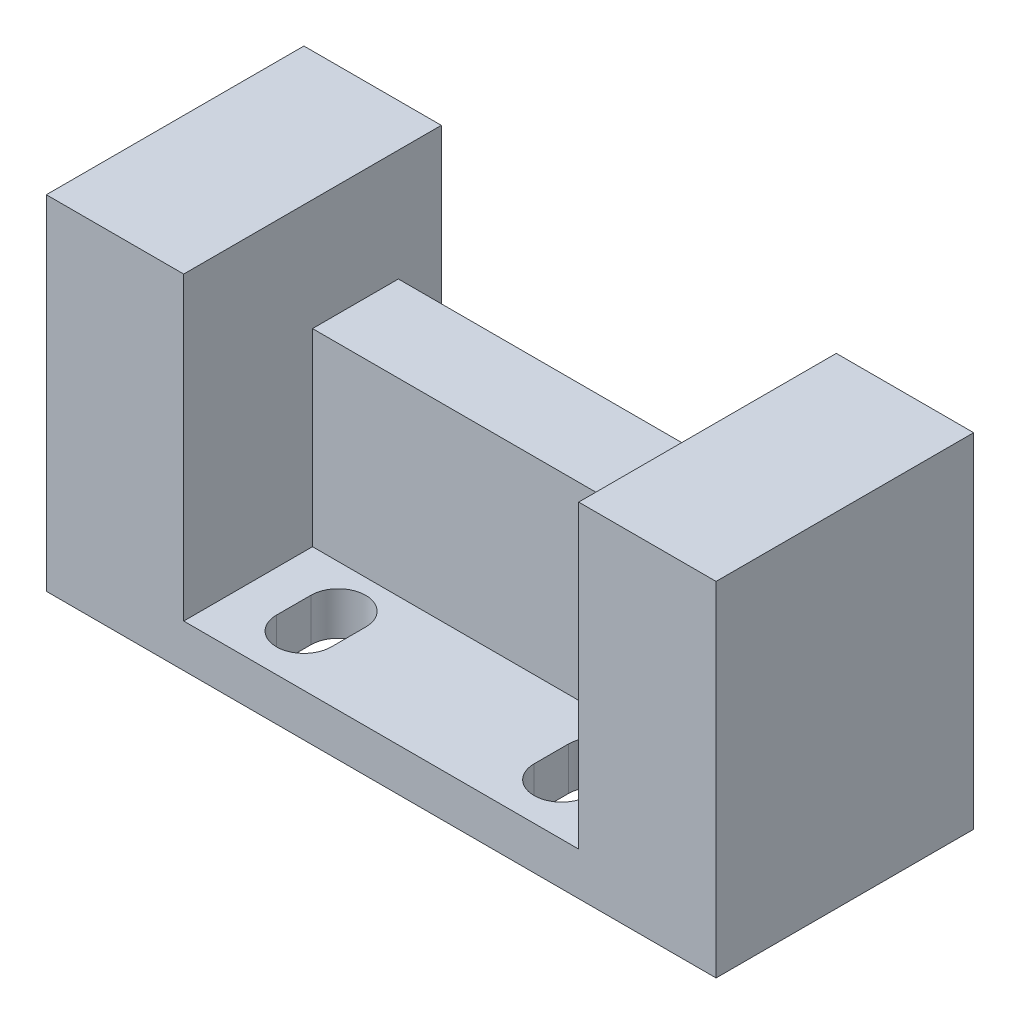
ISO-10303-21;
HEADER;
FILE_DESCRIPTION(('STEP AP214'),'2;1');
FILE_NAME('part.step','',(''),(''),'','','');
FILE_SCHEMA(('AUTOMOTIVE_DESIGN { 1 0 10303 214 1 1 1 1 }'));
ENDSEC;
DATA;
#1=APPLICATION_CONTEXT('core data for automotive mechanical design processes');
#2=APPLICATION_PROTOCOL_DEFINITION('international standard','automotive_design',2000,#1);
#3=PRODUCT_CONTEXT('',#1,'mechanical');
#4=PRODUCT('Part','Part','',(#3));
#5=PRODUCT_RELATED_PRODUCT_CATEGORY('part','',(#4));
#6=PRODUCT_DEFINITION_FORMATION('','',#4);
#7=PRODUCT_DEFINITION_CONTEXT('part definition',#1,'design');
#8=PRODUCT_DEFINITION('design','',#6,#7);
#9=PRODUCT_DEFINITION_SHAPE('','',#8);
#10=(LENGTH_UNIT() NAMED_UNIT(*) SI_UNIT(.MILLI.,.METRE.));
#11=(NAMED_UNIT(*) PLANE_ANGLE_UNIT() SI_UNIT($,.RADIAN.));
#12=(NAMED_UNIT(*) SI_UNIT($,.STERADIAN.) SOLID_ANGLE_UNIT());
#13=UNCERTAINTY_MEASURE_WITH_UNIT(LENGTH_MEASURE(1.E-05),#10,'distance_accuracy_value','');
#14=(GEOMETRIC_REPRESENTATION_CONTEXT(3) GLOBAL_UNCERTAINTY_ASSIGNED_CONTEXT((#13)) GLOBAL_UNIT_ASSIGNED_CONTEXT((#10,
#11,#12)) REPRESENTATION_CONTEXT('',''));
#15=CARTESIAN_POINT('',(0.,0.,0.));
#16=DIRECTION('',(0.,0.,1.));
#17=DIRECTION('',(1.,0.,0.));
#18=AXIS2_PLACEMENT_3D('',#15,#16,#17);
#19=CARTESIAN_POINT('',(0.,2.5,0.));
#20=DIRECTION('',(0.,1.,0.));
#21=DIRECTION('',(0.,0.,1.));
#22=AXIS2_PLACEMENT_3D('',#19,#20,#21);
#23=PLANE('',#22);
#24=DIRECTION('',(0.,0.,-1.));
#25=VECTOR('',#24,1.);
#26=CARTESIAN_POINT('',(8.,2.5,10.));
#27=LINE('',#26,#25);
#28=CARTESIAN_POINT('',(8.,2.5,2.5));
#29=VERTEX_POINT('',#28);
#30=CARTESIAN_POINT('',(8.,2.5,1.00000000000001));
#31=VERTEX_POINT('',#30);
#32=EDGE_CURVE('E318',#29,#31,#27,.T.);
#33=ORIENTED_EDGE('',*,*,#32,.F.);
#34=DIRECTION('',(1.,0.,0.));
#35=VECTOR('',#34,1.);
#36=CARTESIAN_POINT('',(-0.00199999999999853,2.5,2.5));
#37=LINE('',#36,#35);
#38=CARTESIAN_POINT('',(31.,2.5,2.5));
#39=VERTEX_POINT('',#38);
#40=EDGE_CURVE('E216',#29,#39,#37,.T.);
#41=ORIENTED_EDGE('',*,*,#40,.T.);
#42=DIRECTION('',(0.,0.,-1.));
#43=VECTOR('',#42,1.);
#44=CARTESIAN_POINT('',(31.,2.5,0.));
#45=LINE('',#44,#43);
#46=CARTESIAN_POINT('',(31.,2.5,1.00000000000001));
#47=VERTEX_POINT('',#46);
#48=EDGE_CURVE('E195',#39,#47,#45,.T.);
#49=ORIENTED_EDGE('',*,*,#48,.T.);
#50=DIRECTION('',(-1.,0.,0.));
#51=VECTOR('',#50,1.);
#52=CARTESIAN_POINT('',(0.,2.5,1.00000000000001));
#53=LINE('',#52,#51);
#54=EDGE_CURVE('E352',#47,#31,#53,.T.);
#55=ORIENTED_EDGE('',*,*,#54,.T.);
#56=EDGE_LOOP('',(#33,#41,#49,#55));
#57=FACE_BOUND('',#56,.T.);
#58=ADVANCED_FACE('F43',(#57),#23,.T.);
#59=CARTESIAN_POINT('',(31.,0.,10.));
#60=DIRECTION('',(1.,0.,0.));
#61=DIRECTION('',(0.,0.,-1.));
#62=AXIS2_PLACEMENT_3D('',#59,#60,#61);
#63=PLANE('',#62);
#64=DIRECTION('',(0.,-1.,0.));
#65=VECTOR('',#64,1.);
#66=CARTESIAN_POINT('',(31.,2.5,2.5));
#67=LINE('',#66,#65);
#68=CARTESIAN_POINT('',(31.,13.5,2.49999999999999));
#69=VERTEX_POINT('',#68);
#70=EDGE_CURVE('E187',#69,#39,#67,.T.);
#71=ORIENTED_EDGE('',*,*,#70,.F.);
#72=DIRECTION('',(0.,0.,-1.));
#73=VECTOR('',#72,1.);
#74=CARTESIAN_POINT('',(31.,13.5,2.49999999999999));
#75=LINE('',#74,#73);
#76=CARTESIAN_POINT('',(31.,13.5,7.49999999999999));
#77=VERTEX_POINT('',#76);
#78=EDGE_CURVE('E188',#77,#69,#75,.T.);
#79=ORIENTED_EDGE('',*,*,#78,.F.);
#80=DIRECTION('',(0.,1.,0.));
#81=VECTOR('',#80,1.);
#82=CARTESIAN_POINT('',(31.,2.5,7.5));
#83=LINE('',#82,#81);
#84=CARTESIAN_POINT('',(31.,2.5,7.5));
#85=VERTEX_POINT('',#84);
#86=EDGE_CURVE('E205',#85,#77,#83,.T.);
#87=ORIENTED_EDGE('',*,*,#86,.F.);
#88=CARTESIAN_POINT('',(31.,2.5,15.));
#89=VERTEX_POINT('',#88);
#90=EDGE_CURVE('E342',#89,#85,#45,.T.);
#91=ORIENTED_EDGE('',*,*,#90,.F.);
#92=DIRECTION('',(0.,1.,0.));
#93=VECTOR('',#92,1.);
#94=CARTESIAN_POINT('',(31.,2.5,15.));
#95=LINE('',#94,#93);
#96=CARTESIAN_POINT('',(31.,20.,15.));
#97=VERTEX_POINT('',#96);
#98=EDGE_CURVE('E230',#89,#97,#95,.T.);
#99=ORIENTED_EDGE('',*,*,#98,.T.);
#100=DIRECTION('',(0.,0.,-1.));
#101=VECTOR('',#100,1.);
#102=CARTESIAN_POINT('',(31.,20.,10.));
#103=LINE('',#102,#101);
#104=CARTESIAN_POINT('',(31.,20.,0.));
#105=VERTEX_POINT('',#104);
#106=EDGE_CURVE('E301',#97,#105,#103,.T.);
#107=ORIENTED_EDGE('',*,*,#106,.T.);
#108=DIRECTION('',(0.,-1.,0.));
#109=VECTOR('',#108,1.);
#110=CARTESIAN_POINT('',(31.,0.,0.));
#111=LINE('',#110,#109);
#112=CARTESIAN_POINT('',(31.,1.49999999999999,0.));
#113=VERTEX_POINT('',#112);
#114=EDGE_CURVE('E306',#105,#113,#111,.T.);
#115=ORIENTED_EDGE('',*,*,#114,.T.);
#116=DIRECTION('',(0.,-0.707106781186545,-0.70710678118655));
#117=VECTOR('',#116,1.);
#118=CARTESIAN_POINT('',(31.,5.75,4.25000000000004));
#119=LINE('',#118,#117);
#120=EDGE_CURVE('E351',#113,#47,#119,.F.);
#121=ORIENTED_EDGE('',*,*,#120,.T.);
#122=ORIENTED_EDGE('',*,*,#48,.F.);
#123=EDGE_LOOP('',(#71,#79,#87,#91,#99,#107,#115,#121,#122));
#124=FACE_BOUND('',#123,.T.);
#125=ADVANCED_FACE('F189',(#124),#63,.F.);
#126=DIRECTION('',(1.,0.,0.));
#127=VECTOR('',#126,1.);
#128=CARTESIAN_POINT('',(-0.00199999999999853,2.5,7.5));
#129=LINE('',#128,#127);
#130=CARTESIAN_POINT('',(8.,2.5,7.5));
#131=VERTEX_POINT('',#130);
#132=EDGE_CURVE('E215',#131,#85,#129,.T.);
#133=ORIENTED_EDGE('',*,*,#132,.F.);
#134=CARTESIAN_POINT('',(8.,2.5,15.));
#135=VERTEX_POINT('',#134);
#136=EDGE_CURVE('E326',#135,#131,#27,.T.);
#137=ORIENTED_EDGE('',*,*,#136,.F.);
#138=DIRECTION('',(-1.,0.,0.));
#139=VECTOR('',#138,1.);
#140=CARTESIAN_POINT('',(0.,2.5,15.));
#141=LINE('',#140,#139);
#142=EDGE_CURVE('E307',#89,#135,#141,.T.);
#143=ORIENTED_EDGE('',*,*,#142,.F.);
#144=ORIENTED_EDGE('',*,*,#90,.T.);
#145=EDGE_LOOP('',(#133,#137,#143,#144));
#146=FACE_BOUND('',#145,.T.);
#147=CARTESIAN_POINT('',(12.,2.5,12.));
#148=DIRECTION('',(0.,1.,0.));
#149=DIRECTION('',(0.,0.,1.));
#150=AXIS2_PLACEMENT_3D('',#147,#148,#149);
#151=CIRCLE('',#150,1.6);
#152=CARTESIAN_POINT('',(10.4,2.5,12.));
#153=VERTEX_POINT('',#152);
#154=CARTESIAN_POINT('',(13.6,2.5,12.));
#155=VERTEX_POINT('',#154);
#156=EDGE_CURVE('E231',#153,#155,#151,.T.);
#157=ORIENTED_EDGE('',*,*,#156,.F.);
#158=DIRECTION('',(0.,0.,1.));
#159=VECTOR('',#158,1.);
#160=CARTESIAN_POINT('',(10.4,2.5,12.));
#161=LINE('',#160,#159);
#162=CARTESIAN_POINT('',(10.4,2.5,10.));
#163=VERTEX_POINT('',#162);
#164=EDGE_CURVE('E245',#163,#153,#161,.T.);
#165=ORIENTED_EDGE('',*,*,#164,.F.);
#166=CARTESIAN_POINT('',(12.,2.5,10.));
#167=DIRECTION('',(0.,1.,0.));
#168=DIRECTION('',(0.,0.,1.));
#169=AXIS2_PLACEMENT_3D('',#166,#167,#168);
#170=CIRCLE('',#169,1.6);
#171=CARTESIAN_POINT('',(13.6,2.5,10.));
#172=VERTEX_POINT('',#171);
#173=EDGE_CURVE('E237',#172,#163,#170,.T.);
#174=ORIENTED_EDGE('',*,*,#173,.F.);
#175=DIRECTION('',(0.,0.,-1.));
#176=VECTOR('',#175,1.);
#177=CARTESIAN_POINT('',(13.6,2.5,12.));
#178=LINE('',#177,#176);
#179=EDGE_CURVE('E232',#155,#172,#178,.T.);
#180=ORIENTED_EDGE('',*,*,#179,.F.);
#181=EDGE_LOOP('',(#157,#165,#174,#180));
#182=FACE_BOUND('',#181,.T.);
#183=CARTESIAN_POINT('',(27.,2.5,12.));
#184=DIRECTION('',(0.,1.,0.));
#185=DIRECTION('',(0.,0.,1.));
#186=AXIS2_PLACEMENT_3D('',#183,#184,#185);
#187=CIRCLE('',#186,1.6);
#188=CARTESIAN_POINT('',(25.4,2.5,12.));
#189=VERTEX_POINT('',#188);
#190=CARTESIAN_POINT('',(28.6,2.5,12.));
#191=VERTEX_POINT('',#190);
#192=EDGE_CURVE('E236',#189,#191,#187,.T.);
#193=ORIENTED_EDGE('',*,*,#192,.F.);
#194=DIRECTION('',(0.,0.,1.));
#195=VECTOR('',#194,1.);
#196=CARTESIAN_POINT('',(25.4,2.5,12.));
#197=LINE('',#196,#195);
#198=CARTESIAN_POINT('',(25.4,2.5,10.));
#199=VERTEX_POINT('',#198);
#200=EDGE_CURVE('E260',#199,#189,#197,.T.);
#201=ORIENTED_EDGE('',*,*,#200,.F.);
#202=CARTESIAN_POINT('',(27.,2.5,10.));
#203=DIRECTION('',(0.,1.,0.));
#204=DIRECTION('',(0.,0.,1.));
#205=AXIS2_PLACEMENT_3D('',#202,#203,#204);
#206=CIRCLE('',#205,1.6);
#207=CARTESIAN_POINT('',(28.6,2.5,10.));
#208=VERTEX_POINT('',#207);
#209=EDGE_CURVE('E267',#208,#199,#206,.T.);
#210=ORIENTED_EDGE('',*,*,#209,.F.);
#211=DIRECTION('',(0.,0.,-1.));
#212=VECTOR('',#211,1.);
#213=CARTESIAN_POINT('',(28.6,2.5,12.));
#214=LINE('',#213,#212);
#215=EDGE_CURVE('E266',#191,#208,#214,.T.);
#216=ORIENTED_EDGE('',*,*,#215,.F.);
#217=EDGE_LOOP('',(#193,#201,#210,#216));
#218=FACE_BOUND('',#217,.T.);
#219=ADVANCED_FACE('F387',(#146,#182,#218),#23,.T.);
#220=CARTESIAN_POINT('',(0.,0.,10.));
#221=DIRECTION('',(1.,0.,0.));
#222=DIRECTION('',(0.,1.,0.));
#223=AXIS2_PLACEMENT_3D('',#220,#221,#222);
#224=PLANE('',#223);
#225=DIRECTION('',(0.,0.,-1.));
#226=VECTOR('',#225,1.);
#227=CARTESIAN_POINT('',(0.,0.,10.));
#228=LINE('',#227,#226);
#229=CARTESIAN_POINT('',(0.,0.,15.));
#230=VERTEX_POINT('',#229);
#231=CARTESIAN_POINT('',(0.,0.,0.));
#232=VERTEX_POINT('',#231);
#233=EDGE_CURVE('E341',#230,#232,#228,.T.);
#234=ORIENTED_EDGE('',*,*,#233,.F.);
#235=DIRECTION('',(0.,-1.,0.));
#236=VECTOR('',#235,1.);
#237=CARTESIAN_POINT('',(0.,2.5,15.));
#238=LINE('',#237,#236);
#239=CARTESIAN_POINT('',(0.,20.,15.));
#240=VERTEX_POINT('',#239);
#241=EDGE_CURVE('E320',#240,#230,#238,.T.);
#242=ORIENTED_EDGE('',*,*,#241,.F.);
#243=DIRECTION('',(0.,0.,-1.));
#244=VECTOR('',#243,1.);
#245=CARTESIAN_POINT('',(0.,20.,10.));
#246=LINE('',#245,#244);
#247=CARTESIAN_POINT('',(0.,20.,0.));
#248=VERTEX_POINT('',#247);
#249=EDGE_CURVE('E337',#240,#248,#246,.T.);
#250=ORIENTED_EDGE('',*,*,#249,.T.);
#251=DIRECTION('',(0.,-1.,0.));
#252=VECTOR('',#251,1.);
#253=CARTESIAN_POINT('',(0.,0.,0.));
#254=LINE('',#253,#252);
#255=EDGE_CURVE('E329',#248,#232,#254,.T.);
#256=ORIENTED_EDGE('',*,*,#255,.T.);
#257=EDGE_LOOP('',(#234,#242,#250,#256));
#258=FACE_BOUND('',#257,.T.);
#259=ADVANCED_FACE('F422',(#258),#224,.F.);
#260=CARTESIAN_POINT('',(0.,0.,10.));
#261=DIRECTION('',(0.,1.,0.));
#262=DIRECTION('',(0.,0.,1.));
#263=AXIS2_PLACEMENT_3D('',#260,#261,#262);
#264=PLANE('',#263);
#265=DIRECTION('',(0.,0.,1.));
#266=VECTOR('',#265,1.);
#267=CARTESIAN_POINT('',(10.4,0.,10.));
#268=LINE('',#267,#266);
#269=CARTESIAN_POINT('',(10.4,0.,10.));
#270=VERTEX_POINT('',#269);
#271=CARTESIAN_POINT('',(10.4,0.,12.));
#272=VERTEX_POINT('',#271);
#273=EDGE_CURVE('E55',#270,#272,#268,.T.);
#274=ORIENTED_EDGE('',*,*,#273,.T.);
#275=CARTESIAN_POINT('',(12.,0.,12.));
#276=DIRECTION('',(0.,1.,0.));
#277=DIRECTION('',(0.,0.,1.));
#278=AXIS2_PLACEMENT_3D('',#275,#276,#277);
#279=CIRCLE('',#278,1.6);
#280=CARTESIAN_POINT('',(13.6,0.,12.));
#281=VERTEX_POINT('',#280);
#282=EDGE_CURVE('E11',#272,#281,#279,.T.);
#283=ORIENTED_EDGE('',*,*,#282,.T.);
#284=DIRECTION('',(0.,0.,-1.));
#285=VECTOR('',#284,1.);
#286=CARTESIAN_POINT('',(13.6,0.,10.));
#287=LINE('',#286,#285);
#288=CARTESIAN_POINT('',(13.6,0.,10.));
#289=VERTEX_POINT('',#288);
#290=EDGE_CURVE('E367',#281,#289,#287,.T.);
#291=ORIENTED_EDGE('',*,*,#290,.T.);
#292=CARTESIAN_POINT('',(12.,0.,10.));
#293=DIRECTION('',(0.,1.,0.));
#294=DIRECTION('',(0.,0.,1.));
#295=AXIS2_PLACEMENT_3D('',#292,#293,#294);
#296=CIRCLE('',#295,1.6);
#297=EDGE_CURVE('E375',#289,#270,#296,.T.);
#298=ORIENTED_EDGE('',*,*,#297,.T.);
#299=EDGE_LOOP('',(#274,#283,#291,#298));
#300=FACE_BOUND('',#299,.T.);
#301=DIRECTION('',(0.,0.,1.));
#302=VECTOR('',#301,1.);
#303=CARTESIAN_POINT('',(25.4,0.,10.));
#304=LINE('',#303,#302);
#305=CARTESIAN_POINT('',(25.4,0.,10.));
#306=VERTEX_POINT('',#305);
#307=CARTESIAN_POINT('',(25.4,0.,12.));
#308=VERTEX_POINT('',#307);
#309=EDGE_CURVE('E361',#306,#308,#304,.T.);
#310=ORIENTED_EDGE('',*,*,#309,.T.);
#311=CARTESIAN_POINT('',(27.,0.,12.));
#312=DIRECTION('',(0.,1.,0.));
#313=DIRECTION('',(0.,0.,1.));
#314=AXIS2_PLACEMENT_3D('',#311,#312,#313);
#315=CIRCLE('',#314,1.6);
#316=CARTESIAN_POINT('',(28.6,0.,12.));
#317=VERTEX_POINT('',#316);
#318=EDGE_CURVE('E366',#308,#317,#315,.T.);
#319=ORIENTED_EDGE('',*,*,#318,.T.);
#320=DIRECTION('',(0.,0.,-1.));
#321=VECTOR('',#320,1.);
#322=CARTESIAN_POINT('',(28.6,0.,9.99999999999995));
#323=LINE('',#322,#321);
#324=CARTESIAN_POINT('',(28.6,0.,10.));
#325=VERTEX_POINT('',#324);
#326=EDGE_CURVE('E293',#317,#325,#323,.T.);
#327=ORIENTED_EDGE('',*,*,#326,.T.);
#328=CARTESIAN_POINT('',(27.,0.,10.));
#329=DIRECTION('',(0.,1.,0.));
#330=DIRECTION('',(0.,0.,1.));
#331=AXIS2_PLACEMENT_3D('',#328,#329,#330);
#332=CIRCLE('',#331,1.6);
#333=EDGE_CURVE('E359',#325,#306,#332,.T.);
#334=ORIENTED_EDGE('',*,*,#333,.T.);
#335=EDGE_LOOP('',(#310,#319,#327,#334));
#336=FACE_BOUND('',#335,.T.);
#337=DIRECTION('',(0.,0.,1.));
#338=VECTOR('',#337,1.);
#339=CARTESIAN_POINT('',(39.,0.,0.));
#340=LINE('',#339,#338);
#341=CARTESIAN_POINT('',(39.,0.,0.));
#342=VERTEX_POINT('',#341);
#343=CARTESIAN_POINT('',(39.,0.,15.));
#344=VERTEX_POINT('',#343);
#345=EDGE_CURVE('E308',#342,#344,#340,.T.);
#346=ORIENTED_EDGE('',*,*,#345,.T.);
#347=DIRECTION('',(-1.,0.,0.));
#348=VECTOR('',#347,1.);
#349=CARTESIAN_POINT('',(0.,0.,15.));
#350=LINE('',#349,#348);
#351=EDGE_CURVE('E312',#344,#230,#350,.T.);
#352=ORIENTED_EDGE('',*,*,#351,.T.);
#353=ORIENTED_EDGE('',*,*,#233,.T.);
#354=DIRECTION('',(1.,0.,0.));
#355=VECTOR('',#354,1.);
#356=CARTESIAN_POINT('',(0.,0.,0.));
#357=LINE('',#356,#355);
#358=EDGE_CURVE('E330',#232,#342,#357,.T.);
#359=ORIENTED_EDGE('',*,*,#358,.T.);
#360=EDGE_LOOP('',(#346,#352,#353,#359));
#361=FACE_BOUND('',#360,.T.);
#362=ADVANCED_FACE('F376',(#300,#336,#361),#264,.F.);
#363=CARTESIAN_POINT('',(8.,0.,10.));
#364=DIRECTION('',(-1.,0.,0.));
#365=DIRECTION('',(0.,-1.,0.));
#366=AXIS2_PLACEMENT_3D('',#363,#364,#365);
#367=PLANE('',#366);
#368=DIRECTION('',(0.,0.,-1.));
#369=VECTOR('',#368,1.);
#370=CARTESIAN_POINT('',(8.,13.5,2.49999999999999));
#371=LINE('',#370,#369);
#372=CARTESIAN_POINT('',(8.,13.5,7.49999999999999));
#373=VERTEX_POINT('',#372);
#374=CARTESIAN_POINT('',(8.,13.5,2.49999999999999));
#375=VERTEX_POINT('',#374);
#376=EDGE_CURVE('E65',#373,#375,#371,.T.);
#377=ORIENTED_EDGE('',*,*,#376,.T.);
#378=DIRECTION('',(0.,-1.,0.));
#379=VECTOR('',#378,1.);
#380=CARTESIAN_POINT('',(8.,2.5,2.5));
#381=LINE('',#380,#379);
#382=EDGE_CURVE('E202',#375,#29,#381,.T.);
#383=ORIENTED_EDGE('',*,*,#382,.T.);
#384=ORIENTED_EDGE('',*,*,#32,.T.);
#385=DIRECTION('',(0.,0.707106781186545,0.70710678118655));
#386=VECTOR('',#385,1.);
#387=CARTESIAN_POINT('',(8.,5.75,4.25000000000004));
#388=LINE('',#387,#386);
#389=CARTESIAN_POINT('',(8.,1.49999999999999,0.));
#390=VERTEX_POINT('',#389);
#391=EDGE_CURVE('E292',#31,#390,#388,.F.);
#392=ORIENTED_EDGE('',*,*,#391,.T.);
#393=DIRECTION('',(0.,1.,0.));
#394=VECTOR('',#393,1.);
#395=CARTESIAN_POINT('',(8.,0.,0.));
#396=LINE('',#395,#394);
#397=CARTESIAN_POINT('',(8.,20.,0.));
#398=VERTEX_POINT('',#397);
#399=EDGE_CURVE('E334',#390,#398,#396,.T.);
#400=ORIENTED_EDGE('',*,*,#399,.T.);
#401=DIRECTION('',(0.,0.,-1.));
#402=VECTOR('',#401,1.);
#403=CARTESIAN_POINT('',(8.,20.,10.));
#404=LINE('',#403,#402);
#405=CARTESIAN_POINT('',(8.,20.,15.));
#406=VERTEX_POINT('',#405);
#407=EDGE_CURVE('E339',#406,#398,#404,.T.);
#408=ORIENTED_EDGE('',*,*,#407,.F.);
#409=DIRECTION('',(0.,-1.,0.));
#410=VECTOR('',#409,1.);
#411=CARTESIAN_POINT('',(8.,2.5,15.));
#412=LINE('',#411,#410);
#413=EDGE_CURVE('E222',#406,#135,#412,.T.);
#414=ORIENTED_EDGE('',*,*,#413,.T.);
#415=ORIENTED_EDGE('',*,*,#136,.T.);
#416=DIRECTION('',(0.,1.,0.));
#417=VECTOR('',#416,1.);
#418=CARTESIAN_POINT('',(8.,2.5,7.5));
#419=LINE('',#418,#417);
#420=EDGE_CURVE('E56',#131,#373,#419,.T.);
#421=ORIENTED_EDGE('',*,*,#420,.T.);
#422=EDGE_LOOP('',(#377,#383,#384,#392,#400,#408,#414,#415,#421));
#423=FACE_BOUND('',#422,.T.);
#424=ADVANCED_FACE('F431',(#423),#367,.F.);
#425=CARTESIAN_POINT('',(0.,20.,10.));
#426=DIRECTION('',(0.,-1.,0.));
#427=DIRECTION('',(0.,0.,-1.));
#428=AXIS2_PLACEMENT_3D('',#425,#426,#427);
#429=PLANE('',#428);
#430=DIRECTION('',(-1.,0.,0.));
#431=VECTOR('',#430,1.);
#432=CARTESIAN_POINT('',(0.,20.,0.));
#433=LINE('',#432,#431);
#434=EDGE_CURVE('E331',#398,#248,#433,.T.);
#435=ORIENTED_EDGE('',*,*,#434,.T.);
#436=ORIENTED_EDGE('',*,*,#249,.F.);
#437=DIRECTION('',(-1.,0.,0.));
#438=VECTOR('',#437,1.);
#439=CARTESIAN_POINT('',(26.2002747232013,20.,15.));
#440=LINE('',#439,#438);
#441=EDGE_CURVE('E196',#406,#240,#440,.T.);
#442=ORIENTED_EDGE('',*,*,#441,.F.);
#443=ORIENTED_EDGE('',*,*,#407,.T.);
#444=EDGE_LOOP('',(#435,#436,#442,#443));
#445=FACE_BOUND('',#444,.T.);
#446=ADVANCED_FACE('F453',(#445),#429,.F.);
#447=CARTESIAN_POINT('',(0.,0.,0.));
#448=DIRECTION('',(0.,0.,-1.));
#449=DIRECTION('',(-1.,0.,0.));
#450=AXIS2_PLACEMENT_3D('',#447,#448,#449);
#451=PLANE('',#450);
#452=CARTESIAN_POINT('',(3.5,17.,0.));
#453=DIRECTION('',(0.,0.,-1.));
#454=DIRECTION('',(-1.,0.,0.));
#455=AXIS2_PLACEMENT_3D('',#452,#453,#454);
#456=CIRCLE('',#455,2.);
#457=CARTESIAN_POINT('',(1.5,17.,0.));
#458=VERTEX_POINT('',#457);
#459=EDGE_CURVE('E278',#458,#458,#456,.T.);
#460=ORIENTED_EDGE('',*,*,#459,.F.);
#461=EDGE_LOOP('',(#460));
#462=FACE_BOUND('',#461,.T.);
#463=CARTESIAN_POINT('',(35.5,4.,0.));
#464=DIRECTION('',(0.,0.,-1.));
#465=DIRECTION('',(-1.,0.,0.));
#466=AXIS2_PLACEMENT_3D('',#463,#464,#465);
#467=CIRCLE('',#466,2.);
#468=CARTESIAN_POINT('',(33.5,4.,0.));
#469=VERTEX_POINT('',#468);
#470=EDGE_CURVE('E279',#469,#469,#467,.T.);
#471=ORIENTED_EDGE('',*,*,#470,.F.);
#472=EDGE_LOOP('',(#471));
#473=FACE_BOUND('',#472,.T.);
#474=CARTESIAN_POINT('',(3.5,4.,0.));
#475=DIRECTION('',(0.,0.,-1.));
#476=DIRECTION('',(-1.,0.,0.));
#477=AXIS2_PLACEMENT_3D('',#474,#475,#476);
#478=CIRCLE('',#477,2.);
#479=CARTESIAN_POINT('',(1.5,4.,0.));
#480=VERTEX_POINT('',#479);
#481=EDGE_CURVE('E271',#480,#480,#478,.T.);
#482=ORIENTED_EDGE('',*,*,#481,.F.);
#483=EDGE_LOOP('',(#482));
#484=FACE_BOUND('',#483,.T.);
#485=CARTESIAN_POINT('',(35.5,17.,0.));
#486=DIRECTION('',(0.,0.,-1.));
#487=DIRECTION('',(-1.,0.,0.));
#488=AXIS2_PLACEMENT_3D('',#485,#486,#487);
#489=CIRCLE('',#488,2.);
#490=CARTESIAN_POINT('',(33.5,17.,0.));
#491=VERTEX_POINT('',#490);
#492=EDGE_CURVE('E282',#491,#491,#489,.T.);
#493=ORIENTED_EDGE('',*,*,#492,.F.);
#494=EDGE_LOOP('',(#493));
#495=FACE_BOUND('',#494,.T.);
#496=DIRECTION('',(1.,0.,0.));
#497=VECTOR('',#496,1.);
#498=CARTESIAN_POINT('',(0.,1.49999999999999,0.));
#499=LINE('',#498,#497);
#500=EDGE_CURVE('E349',#390,#113,#499,.T.);
#501=ORIENTED_EDGE('',*,*,#500,.T.);
#502=ORIENTED_EDGE('',*,*,#114,.F.);
#503=DIRECTION('',(-1.,0.,0.));
#504=VECTOR('',#503,1.);
#505=CARTESIAN_POINT('',(31.,20.,0.));
#506=LINE('',#505,#504);
#507=CARTESIAN_POINT('',(39.,20.,0.));
#508=VERTEX_POINT('',#507);
#509=EDGE_CURVE('E302',#508,#105,#506,.T.);
#510=ORIENTED_EDGE('',*,*,#509,.F.);
#511=DIRECTION('',(0.,-1.,0.));
#512=VECTOR('',#511,1.);
#513=CARTESIAN_POINT('',(39.,2.5,0.));
#514=LINE('',#513,#512);
#515=EDGE_CURVE('E315',#508,#342,#514,.T.);
#516=ORIENTED_EDGE('',*,*,#515,.T.);
#517=ORIENTED_EDGE('',*,*,#358,.F.);
#518=ORIENTED_EDGE('',*,*,#255,.F.);
#519=ORIENTED_EDGE('',*,*,#434,.F.);
#520=ORIENTED_EDGE('',*,*,#399,.F.);
#521=EDGE_LOOP('',(#501,#502,#510,#516,#517,#518,#519,#520));
#522=FACE_BOUND('',#521,.T.);
#523=ADVANCED_FACE('F447',(#462,#473,#484,#495,#522),#451,.T.);
#524=CARTESIAN_POINT('',(0.,2.5,15.));
#525=DIRECTION('',(0.,0.,1.));
#526=DIRECTION('',(1.,0.,0.));
#527=AXIS2_PLACEMENT_3D('',#524,#525,#526);
#528=PLANE('',#527);
#529=ORIENTED_EDGE('',*,*,#351,.F.);
#530=DIRECTION('',(0.,-1.,0.));
#531=VECTOR('',#530,1.);
#532=CARTESIAN_POINT('',(39.,2.5,15.));
#533=LINE('',#532,#531);
#534=CARTESIAN_POINT('',(39.,20.,15.));
#535=VERTEX_POINT('',#534);
#536=EDGE_CURVE('E324',#535,#344,#533,.T.);
#537=ORIENTED_EDGE('',*,*,#536,.F.);
#538=DIRECTION('',(1.,0.,0.));
#539=VECTOR('',#538,1.);
#540=CARTESIAN_POINT('',(12.7997252767987,20.,15.));
#541=LINE('',#540,#539);
#542=EDGE_CURVE('E221',#97,#535,#541,.T.);
#543=ORIENTED_EDGE('',*,*,#542,.F.);
#544=ORIENTED_EDGE('',*,*,#98,.F.);
#545=ORIENTED_EDGE('',*,*,#142,.T.);
#546=ORIENTED_EDGE('',*,*,#413,.F.);
#547=ORIENTED_EDGE('',*,*,#441,.T.);
#548=ORIENTED_EDGE('',*,*,#241,.T.);
#549=EDGE_LOOP('',(#529,#537,#543,#544,#545,#546,#547,#548));
#550=FACE_BOUND('',#549,.T.);
#551=ADVANCED_FACE('F438',(#550),#528,.T.);
#552=CARTESIAN_POINT('',(39.,2.5,0.));
#553=DIRECTION('',(1.,0.,0.));
#554=DIRECTION('',(0.,0.,-1.));
#555=AXIS2_PLACEMENT_3D('',#552,#553,#554);
#556=PLANE('',#555);
#557=DIRECTION('',(0.,0.,-1.));
#558=VECTOR('',#557,1.);
#559=CARTESIAN_POINT('',(39.,20.,10.));
#560=LINE('',#559,#558);
#561=EDGE_CURVE('E298',#535,#508,#560,.T.);
#562=ORIENTED_EDGE('',*,*,#561,.F.);
#563=ORIENTED_EDGE('',*,*,#536,.T.);
#564=ORIENTED_EDGE('',*,*,#345,.F.);
#565=ORIENTED_EDGE('',*,*,#515,.F.);
#566=EDGE_LOOP('',(#562,#563,#564,#565));
#567=FACE_BOUND('',#566,.T.);
#568=ADVANCED_FACE('F462',(#567),#556,.T.);
#569=CARTESIAN_POINT('',(31.,20.,10.));
#570=DIRECTION('',(0.,-1.,0.));
#571=DIRECTION('',(0.,0.,-1.));
#572=AXIS2_PLACEMENT_3D('',#569,#570,#571);
#573=PLANE('',#572);
#574=ORIENTED_EDGE('',*,*,#509,.T.);
#575=ORIENTED_EDGE('',*,*,#106,.F.);
#576=ORIENTED_EDGE('',*,*,#542,.T.);
#577=ORIENTED_EDGE('',*,*,#561,.T.);
#578=EDGE_LOOP('',(#574,#575,#576,#577));
#579=FACE_BOUND('',#578,.T.);
#580=ADVANCED_FACE('F441',(#579),#573,.F.);
#581=CARTESIAN_POINT('',(0.,1.49999999999999,0.));
#582=DIRECTION('',(0.,-0.70710678118655,0.707106781186545));
#583=DIRECTION('',(1.,0.,0.));
#584=AXIS2_PLACEMENT_3D('',#581,#582,#583);
#585=PLANE('',#584);
#586=ORIENTED_EDGE('',*,*,#391,.F.);
#587=ORIENTED_EDGE('',*,*,#54,.F.);
#588=ORIENTED_EDGE('',*,*,#120,.F.);
#589=ORIENTED_EDGE('',*,*,#500,.F.);
#590=EDGE_LOOP('',(#586,#587,#588,#589));
#591=FACE_BOUND('',#590,.T.);
#592=ADVANCED_FACE('F46',(#591),#585,.F.);
#593=CARTESIAN_POINT('',(35.5,17.,10.));
#594=DIRECTION('',(0.,0.,-1.));
#595=DIRECTION('',(-1.,0.,0.));
#596=AXIS2_PLACEMENT_3D('',#593,#594,#595);
#597=CYLINDRICAL_SURFACE('',#596,2.);
#598=CARTESIAN_POINT('',(35.5,17.,10.));
#599=DIRECTION('',(0.,0.,-1.));
#600=DIRECTION('',(-1.,0.,0.));
#601=AXIS2_PLACEMENT_3D('',#598,#599,#600);
#602=CIRCLE('',#601,2.);
#603=CARTESIAN_POINT('',(33.5,17.,10.));
#604=VERTEX_POINT('',#603);
#605=EDGE_CURVE('E291',#604,#604,#602,.T.);
#606=ORIENTED_EDGE('',*,*,#605,.F.);
#607=EDGE_LOOP('',(#606));
#608=FACE_BOUND('',#607,.T.);
#609=ORIENTED_EDGE('',*,*,#492,.T.);
#610=EDGE_LOOP('',(#609));
#611=FACE_BOUND('',#610,.T.);
#612=ADVANCED_FACE('F626',(#608,#611),#597,.F.);
#613=CARTESIAN_POINT('',(3.5,4.,10.));
#614=DIRECTION('',(0.,0.,-1.));
#615=DIRECTION('',(-1.,0.,0.));
#616=AXIS2_PLACEMENT_3D('',#613,#614,#615);
#617=PLANE('',#616);
#618=CARTESIAN_POINT('',(3.5,4.,10.));
#619=DIRECTION('',(0.,0.,-1.));
#620=DIRECTION('',(-1.,0.,0.));
#621=AXIS2_PLACEMENT_3D('',#618,#619,#620);
#622=CIRCLE('',#621,2.);
#623=CARTESIAN_POINT('',(1.5,4.,10.));
#624=VERTEX_POINT('',#623);
#625=EDGE_CURVE('E247',#624,#624,#622,.T.);
#626=ORIENTED_EDGE('',*,*,#625,.T.);
#627=EDGE_LOOP('',(#626));
#628=FACE_BOUND('',#627,.T.);
#629=ADVANCED_FACE('F625',(#628),#617,.T.);
#630=CARTESIAN_POINT('',(3.5,4.,10.));
#631=DIRECTION('',(0.,0.,-1.));
#632=DIRECTION('',(-1.,0.,0.));
#633=AXIS2_PLACEMENT_3D('',#630,#631,#632);
#634=CYLINDRICAL_SURFACE('',#633,2.);
#635=ORIENTED_EDGE('',*,*,#625,.F.);
#636=EDGE_LOOP('',(#635));
#637=FACE_BOUND('',#636,.T.);
#638=ORIENTED_EDGE('',*,*,#481,.T.);
#639=EDGE_LOOP('',(#638));
#640=FACE_BOUND('',#639,.T.);
#641=ADVANCED_FACE('F622',(#637,#640),#634,.F.);
#642=CARTESIAN_POINT('',(35.5,4.,10.));
#643=DIRECTION('',(0.,0.,-1.));
#644=DIRECTION('',(-1.,0.,0.));
#645=AXIS2_PLACEMENT_3D('',#642,#643,#644);
#646=CYLINDRICAL_SURFACE('',#645,2.);
#647=CARTESIAN_POINT('',(35.5,4.,10.));
#648=DIRECTION('',(0.,0.,-1.));
#649=DIRECTION('',(-1.,0.,0.));
#650=AXIS2_PLACEMENT_3D('',#647,#648,#649);
#651=CIRCLE('',#650,2.);
#652=CARTESIAN_POINT('',(33.5,4.,10.));
#653=VERTEX_POINT('',#652);
#654=EDGE_CURVE('E290',#653,#653,#651,.T.);
#655=ORIENTED_EDGE('',*,*,#654,.F.);
#656=EDGE_LOOP('',(#655));
#657=FACE_BOUND('',#656,.T.);
#658=ORIENTED_EDGE('',*,*,#470,.T.);
#659=EDGE_LOOP('',(#658));
#660=FACE_BOUND('',#659,.T.);
#661=ADVANCED_FACE('F585',(#657,#660),#646,.F.);
#662=CARTESIAN_POINT('',(35.5,4.,10.));
#663=DIRECTION('',(0.,0.,-1.));
#664=DIRECTION('',(-1.,0.,0.));
#665=AXIS2_PLACEMENT_3D('',#662,#663,#664);
#666=PLANE('',#665);
#667=ORIENTED_EDGE('',*,*,#654,.T.);
#668=EDGE_LOOP('',(#667));
#669=FACE_BOUND('',#668,.T.);
#670=ADVANCED_FACE('F580',(#669),#666,.T.);
#671=CARTESIAN_POINT('',(3.5,17.,10.));
#672=DIRECTION('',(0.,0.,-1.));
#673=DIRECTION('',(-1.,0.,0.));
#674=AXIS2_PLACEMENT_3D('',#671,#672,#673);
#675=CYLINDRICAL_SURFACE('',#674,2.);
#676=CARTESIAN_POINT('',(3.5,17.,10.));
#677=DIRECTION('',(0.,0.,-1.));
#678=DIRECTION('',(-1.,0.,0.));
#679=AXIS2_PLACEMENT_3D('',#676,#677,#678);
#680=CIRCLE('',#679,2.);
#681=CARTESIAN_POINT('',(1.5,17.,10.));
#682=VERTEX_POINT('',#681);
#683=EDGE_CURVE('E284',#682,#682,#680,.T.);
#684=ORIENTED_EDGE('',*,*,#683,.F.);
#685=EDGE_LOOP('',(#684));
#686=FACE_BOUND('',#685,.T.);
#687=ORIENTED_EDGE('',*,*,#459,.T.);
#688=EDGE_LOOP('',(#687));
#689=FACE_BOUND('',#688,.T.);
#690=ADVANCED_FACE('F481',(#686,#689),#675,.F.);
#691=CARTESIAN_POINT('',(27.,-7.5,12.));
#692=DIRECTION('',(0.,1.,0.));
#693=DIRECTION('',(0.,0.,1.));
#694=AXIS2_PLACEMENT_3D('',#691,#692,#693);
#695=CYLINDRICAL_SURFACE('',#694,1.6);
#696=DIRECTION('',(0.,1.,0.));
#697=VECTOR('',#696,1.);
#698=CARTESIAN_POINT('',(25.4,-7.5,12.));
#699=LINE('',#698,#697);
#700=EDGE_CURVE('E235',#308,#189,#699,.T.);
#701=ORIENTED_EDGE('',*,*,#700,.T.);
#702=ORIENTED_EDGE('',*,*,#192,.T.);
#703=DIRECTION('',(0.,1.,0.));
#704=VECTOR('',#703,1.);
#705=CARTESIAN_POINT('',(28.6,-7.5,12.));
#706=LINE('',#705,#704);
#707=EDGE_CURVE('E253',#317,#191,#706,.T.);
#708=ORIENTED_EDGE('',*,*,#707,.F.);
#709=ORIENTED_EDGE('',*,*,#318,.F.);
#710=EDGE_LOOP('',(#701,#702,#708,#709));
#711=FACE_BOUND('',#710,.T.);
#712=ADVANCED_FACE('F486',(#711),#695,.F.);
#713=CARTESIAN_POINT('',(25.4,-7.5,12.));
#714=DIRECTION('',(-1.,0.,0.));
#715=DIRECTION('',(0.,0.,1.));
#716=AXIS2_PLACEMENT_3D('',#713,#714,#715);
#717=PLANE('',#716);
#718=DIRECTION('',(0.,1.,0.));
#719=VECTOR('',#718,1.);
#720=CARTESIAN_POINT('',(25.4,-7.5,10.));
#721=LINE('',#720,#719);
#722=EDGE_CURVE('E261',#306,#199,#721,.T.);
#723=ORIENTED_EDGE('',*,*,#722,.T.);
#724=ORIENTED_EDGE('',*,*,#200,.T.);
#725=ORIENTED_EDGE('',*,*,#700,.F.);
#726=ORIENTED_EDGE('',*,*,#309,.F.);
#727=EDGE_LOOP('',(#723,#724,#725,#726));
#728=FACE_BOUND('',#727,.T.);
#729=ADVANCED_FACE('F495',(#728),#717,.F.);
#730=CARTESIAN_POINT('',(27.,-7.5,10.));
#731=DIRECTION('',(0.,1.,0.));
#732=DIRECTION('',(0.,0.,1.));
#733=AXIS2_PLACEMENT_3D('',#730,#731,#732);
#734=CYLINDRICAL_SURFACE('',#733,1.6);
#735=DIRECTION('',(0.,1.,0.));
#736=VECTOR('',#735,1.);
#737=CARTESIAN_POINT('',(28.6,-7.5,10.));
#738=LINE('',#737,#736);
#739=EDGE_CURVE('E258',#325,#208,#738,.T.);
#740=ORIENTED_EDGE('',*,*,#739,.T.);
#741=ORIENTED_EDGE('',*,*,#209,.T.);
#742=ORIENTED_EDGE('',*,*,#722,.F.);
#743=ORIENTED_EDGE('',*,*,#333,.F.);
#744=EDGE_LOOP('',(#740,#741,#742,#743));
#745=FACE_BOUND('',#744,.T.);
#746=ADVANCED_FACE('F501',(#745),#734,.F.);
#747=CARTESIAN_POINT('',(28.6,-7.5,12.));
#748=DIRECTION('',(1.,0.,0.));
#749=DIRECTION('',(0.,0.,-1.));
#750=AXIS2_PLACEMENT_3D('',#747,#748,#749);
#751=PLANE('',#750);
#752=ORIENTED_EDGE('',*,*,#707,.T.);
#753=ORIENTED_EDGE('',*,*,#215,.T.);
#754=ORIENTED_EDGE('',*,*,#739,.F.);
#755=ORIENTED_EDGE('',*,*,#326,.F.);
#756=EDGE_LOOP('',(#752,#753,#754,#755));
#757=FACE_BOUND('',#756,.T.);
#758=ADVANCED_FACE('F509',(#757),#751,.F.);
#759=CARTESIAN_POINT('',(12.,-7.5,12.));
#760=DIRECTION('',(0.,1.,0.));
#761=DIRECTION('',(0.,0.,1.));
#762=AXIS2_PLACEMENT_3D('',#759,#760,#761);
#763=CYLINDRICAL_SURFACE('',#762,1.6);
#764=DIRECTION('',(0.,1.,0.));
#765=VECTOR('',#764,1.);
#766=CARTESIAN_POINT('',(10.4,-7.5,12.));
#767=LINE('',#766,#765);
#768=EDGE_CURVE('E246',#272,#153,#767,.T.);
#769=ORIENTED_EDGE('',*,*,#768,.T.);
#770=ORIENTED_EDGE('',*,*,#156,.T.);
#771=DIRECTION('',(0.,1.,0.));
#772=VECTOR('',#771,1.);
#773=CARTESIAN_POINT('',(13.6,-7.5,12.));
#774=LINE('',#773,#772);
#775=EDGE_CURVE('E244',#281,#155,#774,.T.);
#776=ORIENTED_EDGE('',*,*,#775,.F.);
#777=ORIENTED_EDGE('',*,*,#282,.F.);
#778=EDGE_LOOP('',(#769,#770,#776,#777));
#779=FACE_BOUND('',#778,.T.);
#780=ADVANCED_FACE('F393',(#779),#763,.F.);
#781=CARTESIAN_POINT('',(10.4,-7.5,12.));
#782=DIRECTION('',(-1.,0.,0.));
#783=DIRECTION('',(0.,0.,1.));
#784=AXIS2_PLACEMENT_3D('',#781,#782,#783);
#785=PLANE('',#784);
#786=DIRECTION('',(0.,1.,0.));
#787=VECTOR('',#786,1.);
#788=CARTESIAN_POINT('',(10.4,-7.5,10.));
#789=LINE('',#788,#787);
#790=EDGE_CURVE('E248',#270,#163,#789,.T.);
#791=ORIENTED_EDGE('',*,*,#790,.T.);
#792=ORIENTED_EDGE('',*,*,#164,.T.);
#793=ORIENTED_EDGE('',*,*,#768,.F.);
#794=ORIENTED_EDGE('',*,*,#273,.F.);
#795=EDGE_LOOP('',(#791,#792,#793,#794));
#796=FACE_BOUND('',#795,.T.);
#797=ADVANCED_FACE('F385',(#796),#785,.F.);
#798=CARTESIAN_POINT('',(12.,-7.5,10.));
#799=DIRECTION('',(0.,1.,0.));
#800=DIRECTION('',(0.,0.,1.));
#801=AXIS2_PLACEMENT_3D('',#798,#799,#800);
#802=CYLINDRICAL_SURFACE('',#801,1.6);
#803=DIRECTION('',(0.,1.,0.));
#804=VECTOR('',#803,1.);
#805=CARTESIAN_POINT('',(13.6,-7.5,10.));
#806=LINE('',#805,#804);
#807=EDGE_CURVE('E252',#289,#172,#806,.T.);
#808=ORIENTED_EDGE('',*,*,#807,.T.);
#809=ORIENTED_EDGE('',*,*,#173,.T.);
#810=ORIENTED_EDGE('',*,*,#790,.F.);
#811=ORIENTED_EDGE('',*,*,#297,.F.);
#812=EDGE_LOOP('',(#808,#809,#810,#811));
#813=FACE_BOUND('',#812,.T.);
#814=ADVANCED_FACE('F381',(#813),#802,.F.);
#815=CARTESIAN_POINT('',(13.6,-7.5,12.));
#816=DIRECTION('',(1.,0.,0.));
#817=DIRECTION('',(0.,0.,-1.));
#818=AXIS2_PLACEMENT_3D('',#815,#816,#817);
#819=PLANE('',#818);
#820=ORIENTED_EDGE('',*,*,#775,.T.);
#821=ORIENTED_EDGE('',*,*,#179,.T.);
#822=ORIENTED_EDGE('',*,*,#807,.F.);
#823=ORIENTED_EDGE('',*,*,#290,.F.);
#824=EDGE_LOOP('',(#820,#821,#822,#823));
#825=FACE_BOUND('',#824,.T.);
#826=ADVANCED_FACE('F397',(#825),#819,.F.);
#827=CARTESIAN_POINT('',(12.7997252767987,20.,10.));
#828=DIRECTION('',(0.,0.,-1.));
#829=DIRECTION('',(-1.,0.,0.));
#830=AXIS2_PLACEMENT_3D('',#827,#828,#829);
#831=PLANE('',#830);
#832=ORIENTED_EDGE('',*,*,#605,.T.);
#833=EDGE_LOOP('',(#832));
#834=FACE_BOUND('',#833,.T.);
#835=ADVANCED_FACE('F400',(#834),#831,.T.);
#836=CARTESIAN_POINT('',(26.2002747232013,20.,10.));
#837=DIRECTION('',(0.,0.,-1.));
#838=DIRECTION('',(-1.,0.,0.));
#839=AXIS2_PLACEMENT_3D('',#836,#837,#838);
#840=PLANE('',#839);
#841=ORIENTED_EDGE('',*,*,#683,.T.);
#842=EDGE_LOOP('',(#841));
#843=FACE_BOUND('',#842,.T.);
#844=ADVANCED_FACE('F403',(#843),#840,.T.);
#845=CARTESIAN_POINT('',(-0.00199999999999853,2.5,2.5));
#846=DIRECTION('',(0.,0.,1.));
#847=DIRECTION('',(0.,-1.,0.));
#848=AXIS2_PLACEMENT_3D('',#845,#846,#847);
#849=PLANE('',#848);
#850=ORIENTED_EDGE('',*,*,#382,.F.);
#851=DIRECTION('',(1.,0.,0.));
#852=VECTOR('',#851,1.);
#853=CARTESIAN_POINT('',(-0.00199999999999853,13.5,2.49999999999999));
#854=LINE('',#853,#852);
#855=EDGE_CURVE('E198',#375,#69,#854,.T.);
#856=ORIENTED_EDGE('',*,*,#855,.T.);
#857=ORIENTED_EDGE('',*,*,#70,.T.);
#858=ORIENTED_EDGE('',*,*,#40,.F.);
#859=EDGE_LOOP('',(#850,#856,#857,#858));
#860=FACE_BOUND('',#859,.T.);
#861=ADVANCED_FACE('F200',(#860),#849,.F.);
#862=CARTESIAN_POINT('',(-0.00199999999999853,13.5,2.49999999999999));
#863=DIRECTION('',(0.,-1.,0.));
#864=DIRECTION('',(0.,0.,-1.));
#865=AXIS2_PLACEMENT_3D('',#862,#863,#864);
#866=PLANE('',#865);
#867=ORIENTED_EDGE('',*,*,#376,.F.);
#868=DIRECTION('',(1.,0.,0.));
#869=VECTOR('',#868,1.);
#870=CARTESIAN_POINT('',(-0.00199999999999853,13.5,7.49999999999999));
#871=LINE('',#870,#869);
#872=EDGE_CURVE('E201',#373,#77,#871,.T.);
#873=ORIENTED_EDGE('',*,*,#872,.T.);
#874=ORIENTED_EDGE('',*,*,#78,.T.);
#875=ORIENTED_EDGE('',*,*,#855,.F.);
#876=EDGE_LOOP('',(#867,#873,#874,#875));
#877=FACE_BOUND('',#876,.T.);
#878=ADVANCED_FACE('F207',(#877),#866,.F.);
#879=CARTESIAN_POINT('',(-0.00199999999999853,2.5,7.5));
#880=DIRECTION('',(0.,0.,-1.));
#881=DIRECTION('',(0.,1.,0.));
#882=AXIS2_PLACEMENT_3D('',#879,#880,#881);
#883=PLANE('',#882);
#884=ORIENTED_EDGE('',*,*,#420,.F.);
#885=ORIENTED_EDGE('',*,*,#132,.T.);
#886=ORIENTED_EDGE('',*,*,#86,.T.);
#887=ORIENTED_EDGE('',*,*,#872,.F.);
#888=EDGE_LOOP('',(#884,#885,#886,#887));
#889=FACE_BOUND('',#888,.T.);
#890=ADVANCED_FACE('F433',(#889),#883,.F.);
#891=CLOSED_SHELL('',(#58,#125,#219,#259,#362,#424,#446,#523,#551,#568,#580,#592,#612,#629,#641,
#661,#670,#690,#712,#729,#746,#758,#780,#797,#814,#826,#835,#844,#861,#878,#890));
#892=MANIFOLD_SOLID_BREP('B2',#891);
#893=ADVANCED_BREP_SHAPE_REPRESENTATION('',(#18,#892),#14);
#894=SHAPE_DEFINITION_REPRESENTATION(#9,#893);
ENDSEC;
END-ISO-10303-21;
